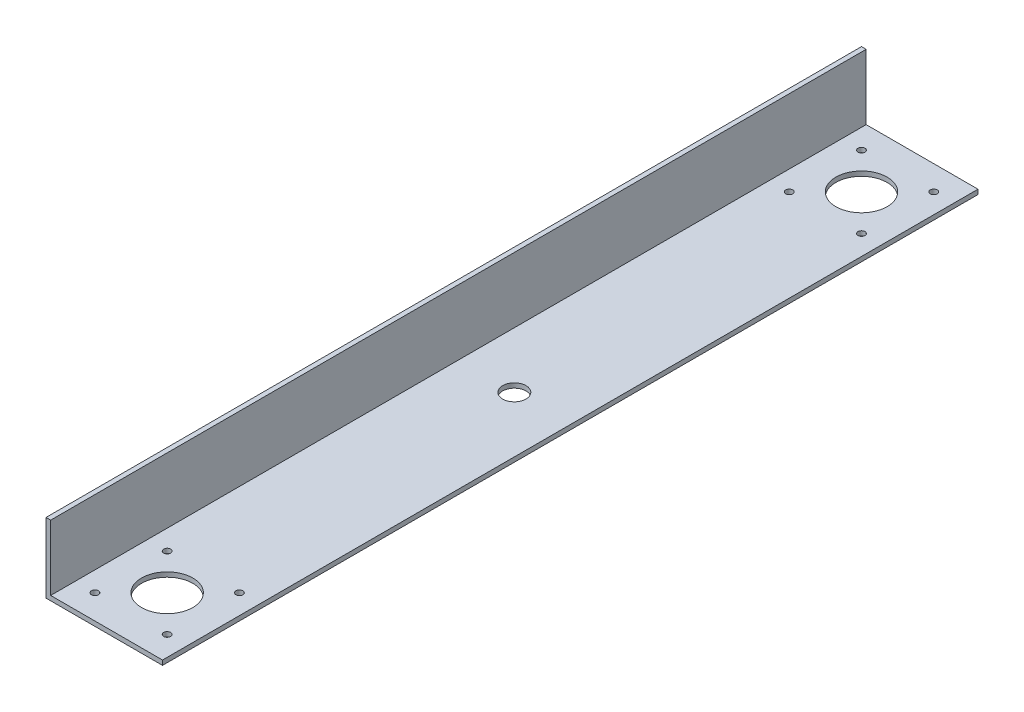
ISO-10303-21;
HEADER;
FILE_DESCRIPTION(('STEP AP214'),'2;1');
FILE_NAME('part.step','',(''),(''),'','','');
FILE_SCHEMA(('AUTOMOTIVE_DESIGN { 1 0 10303 214 1 1 1 1 }'));
ENDSEC;
DATA;
#1=APPLICATION_CONTEXT('core data for automotive mechanical design processes');
#2=APPLICATION_PROTOCOL_DEFINITION('international standard','automotive_design',2000,#1);
#3=PRODUCT_CONTEXT('',#1,'mechanical');
#4=PRODUCT('Part','Part','',(#3));
#5=PRODUCT_RELATED_PRODUCT_CATEGORY('part','',(#4));
#6=PRODUCT_DEFINITION_FORMATION('','',#4);
#7=PRODUCT_DEFINITION_CONTEXT('part definition',#1,'design');
#8=PRODUCT_DEFINITION('design','',#6,#7);
#9=PRODUCT_DEFINITION_SHAPE('','',#8);
#10=(LENGTH_UNIT() NAMED_UNIT(*) SI_UNIT(.MILLI.,.METRE.));
#11=(NAMED_UNIT(*) PLANE_ANGLE_UNIT() SI_UNIT($,.RADIAN.));
#12=(NAMED_UNIT(*) SI_UNIT($,.STERADIAN.) SOLID_ANGLE_UNIT());
#13=UNCERTAINTY_MEASURE_WITH_UNIT(LENGTH_MEASURE(1.E-05),#10,'distance_accuracy_value','');
#14=(GEOMETRIC_REPRESENTATION_CONTEXT(3) GLOBAL_UNCERTAINTY_ASSIGNED_CONTEXT((#13)) GLOBAL_UNIT_ASSIGNED_CONTEXT((#10,
#11,#12)) REPRESENTATION_CONTEXT('',''));
#15=CARTESIAN_POINT('',(0.,0.,0.));
#16=DIRECTION('',(0.,0.,1.));
#17=DIRECTION('',(1.,0.,0.));
#18=AXIS2_PLACEMENT_3D('',#15,#16,#17);
#19=CARTESIAN_POINT('',(50.,0.,350.));
#20=DIRECTION('',(0.,1.,0.));
#21=DIRECTION('',(-1.,0.,0.));
#22=AXIS2_PLACEMENT_3D('',#19,#20,#21);
#23=PLANE('',#22);
#24=CARTESIAN_POINT('',(26.0000005719738,0.,175.));
#25=DIRECTION('',(0.,-1.,0.));
#26=DIRECTION('',(1.,0.,0.));
#27=AXIS2_PLACEMENT_3D('',#24,#25,#26);
#28=CIRCLE('',#27,5.);
#29=CARTESIAN_POINT('',(31.0000005719738,0.,175.));
#30=VERTEX_POINT('',#29);
#31=EDGE_CURVE('E226',#30,#30,#28,.T.);
#32=ORIENTED_EDGE('',*,*,#31,.F.);
#33=EDGE_LOOP('',(#32));
#34=FACE_BOUND('',#33,.T.);
#35=CARTESIAN_POINT('',(10.5,0.,41.5));
#36=DIRECTION('',(0.,-1.,0.));
#37=DIRECTION('',(1.,0.,0.));
#38=AXIS2_PLACEMENT_3D('',#35,#36,#37);
#39=CIRCLE('',#38,1.5);
#40=CARTESIAN_POINT('',(12.,0.,41.5));
#41=VERTEX_POINT('',#40);
#42=EDGE_CURVE('E153',#41,#41,#39,.T.);
#43=ORIENTED_EDGE('',*,*,#42,.F.);
#44=EDGE_LOOP('',(#43));
#45=FACE_BOUND('',#44,.T.);
#46=CARTESIAN_POINT('',(10.5,0.,10.5));
#47=DIRECTION('',(0.,-1.,0.));
#48=DIRECTION('',(1.,0.,0.));
#49=AXIS2_PLACEMENT_3D('',#46,#47,#48);
#50=CIRCLE('',#49,1.49999999999999);
#51=CARTESIAN_POINT('',(12.,0.,10.5));
#52=VERTEX_POINT('',#51);
#53=EDGE_CURVE('E233',#52,#52,#50,.T.);
#54=ORIENTED_EDGE('',*,*,#53,.F.);
#55=EDGE_LOOP('',(#54));
#56=FACE_BOUND('',#55,.T.);
#57=CARTESIAN_POINT('',(41.5,0.,10.5));
#58=DIRECTION('',(0.,-1.,0.));
#59=DIRECTION('',(1.,0.,0.));
#60=AXIS2_PLACEMENT_3D('',#57,#58,#59);
#61=CIRCLE('',#60,1.5);
#62=CARTESIAN_POINT('',(43.,0.,10.5));
#63=VERTEX_POINT('',#62);
#64=EDGE_CURVE('E165',#63,#63,#61,.T.);
#65=ORIENTED_EDGE('',*,*,#64,.F.);
#66=EDGE_LOOP('',(#65));
#67=FACE_BOUND('',#66,.T.);
#68=CARTESIAN_POINT('',(41.5,0.,41.5));
#69=DIRECTION('',(0.,-1.,0.));
#70=DIRECTION('',(1.,0.,0.));
#71=AXIS2_PLACEMENT_3D('',#68,#69,#70);
#72=CIRCLE('',#71,1.49999999999999);
#73=CARTESIAN_POINT('',(43.,0.,41.5));
#74=VERTEX_POINT('',#73);
#75=EDGE_CURVE('E148',#74,#74,#72,.T.);
#76=ORIENTED_EDGE('',*,*,#75,.F.);
#77=EDGE_LOOP('',(#76));
#78=FACE_BOUND('',#77,.T.);
#79=CARTESIAN_POINT('',(26.0000000000068,0.,25.9999999999994));
#80=DIRECTION('',(0.,-1.,0.));
#81=DIRECTION('',(1.,0.,0.));
#82=AXIS2_PLACEMENT_3D('',#79,#80,#81);
#83=CIRCLE('',#82,11.0000000000067);
#84=CARTESIAN_POINT('',(37.0000000000136,0.,25.9999999999994));
#85=VERTEX_POINT('',#84);
#86=EDGE_CURVE('E144',#85,#85,#83,.T.);
#87=ORIENTED_EDGE('',*,*,#86,.F.);
#88=EDGE_LOOP('',(#87));
#89=FACE_BOUND('',#88,.T.);
#90=CARTESIAN_POINT('',(26.0000000000122,0.,323.999999999999));
#91=DIRECTION('',(0.,1.,0.));
#92=DIRECTION('',(0.,0.,1.));
#93=AXIS2_PLACEMENT_3D('',#90,#91,#92);
#94=CIRCLE('',#93,11.0000000000065);
#95=CARTESIAN_POINT('',(26.0000000000122,0.,335.000000000006));
#96=VERTEX_POINT('',#95);
#97=EDGE_CURVE('E169',#96,#96,#94,.T.);
#98=ORIENTED_EDGE('',*,*,#97,.T.);
#99=EDGE_LOOP('',(#98));
#100=FACE_BOUND('',#99,.T.);
#101=CARTESIAN_POINT('',(41.5,0.,308.5));
#102=DIRECTION('',(0.,1.,0.));
#103=DIRECTION('',(0.,0.,1.));
#104=AXIS2_PLACEMENT_3D('',#101,#102,#103);
#105=CIRCLE('',#104,1.49999999999999);
#106=CARTESIAN_POINT('',(41.5,0.,310.));
#107=VERTEX_POINT('',#106);
#108=EDGE_CURVE('E182',#107,#107,#105,.T.);
#109=ORIENTED_EDGE('',*,*,#108,.T.);
#110=EDGE_LOOP('',(#109));
#111=FACE_BOUND('',#110,.T.);
#112=CARTESIAN_POINT('',(10.5,0.,339.5));
#113=DIRECTION('',(0.,1.,0.));
#114=DIRECTION('',(0.,0.,1.));
#115=AXIS2_PLACEMENT_3D('',#112,#113,#114);
#116=CIRCLE('',#115,1.5);
#117=CARTESIAN_POINT('',(10.5,0.,341.));
#118=VERTEX_POINT('',#117);
#119=EDGE_CURVE('E175',#118,#118,#116,.T.);
#120=ORIENTED_EDGE('',*,*,#119,.T.);
#121=EDGE_LOOP('',(#120));
#122=FACE_BOUND('',#121,.T.);
#123=CARTESIAN_POINT('',(10.5,0.,308.5));
#124=DIRECTION('',(0.,1.,0.));
#125=DIRECTION('',(0.,0.,1.));
#126=AXIS2_PLACEMENT_3D('',#123,#124,#125);
#127=CIRCLE('',#126,1.5);
#128=CARTESIAN_POINT('',(10.5,0.,310.));
#129=VERTEX_POINT('',#128);
#130=EDGE_CURVE('E187',#129,#129,#127,.T.);
#131=ORIENTED_EDGE('',*,*,#130,.T.);
#132=EDGE_LOOP('',(#131));
#133=FACE_BOUND('',#132,.T.);
#134=CARTESIAN_POINT('',(41.5,0.,339.5));
#135=DIRECTION('',(0.,1.,0.));
#136=DIRECTION('',(0.,0.,1.));
#137=AXIS2_PLACEMENT_3D('',#134,#135,#136);
#138=CIRCLE('',#137,1.50000000000002);
#139=CARTESIAN_POINT('',(41.5,0.,341.));
#140=VERTEX_POINT('',#139);
#141=EDGE_CURVE('E127',#140,#140,#138,.T.);
#142=ORIENTED_EDGE('',*,*,#141,.T.);
#143=EDGE_LOOP('',(#142));
#144=FACE_BOUND('',#143,.T.);
#145=DIRECTION('',(1.,0.,0.));
#146=VECTOR('',#145,1.);
#147=CARTESIAN_POINT('',(50.,0.,0.));
#148=LINE('',#147,#146);
#149=CARTESIAN_POINT('',(0.,0.,0.));
#150=VERTEX_POINT('',#149);
#151=CARTESIAN_POINT('',(50.,0.,0.));
#152=VERTEX_POINT('',#151);
#153=EDGE_CURVE('E123',#150,#152,#148,.T.);
#154=ORIENTED_EDGE('',*,*,#153,.T.);
#155=DIRECTION('',(0.,0.,-1.));
#156=VECTOR('',#155,1.);
#157=CARTESIAN_POINT('',(50.,0.,350.));
#158=LINE('',#157,#156);
#159=CARTESIAN_POINT('',(50.,0.,350.));
#160=VERTEX_POINT('',#159);
#161=EDGE_CURVE('E11',#160,#152,#158,.T.);
#162=ORIENTED_EDGE('',*,*,#161,.F.);
#163=DIRECTION('',(1.,0.,0.));
#164=VECTOR('',#163,1.);
#165=CARTESIAN_POINT('',(50.,0.,350.));
#166=LINE('',#165,#164);
#167=CARTESIAN_POINT('',(0.,0.,350.));
#168=VERTEX_POINT('',#167);
#169=EDGE_CURVE('E134',#168,#160,#166,.T.);
#170=ORIENTED_EDGE('',*,*,#169,.F.);
#171=DIRECTION('',(0.,0.,-1.));
#172=VECTOR('',#171,1.);
#173=CARTESIAN_POINT('',(0.,0.,350.));
#174=LINE('',#173,#172);
#175=EDGE_CURVE('E119',#168,#150,#174,.T.);
#176=ORIENTED_EDGE('',*,*,#175,.T.);
#177=EDGE_LOOP('',(#154,#162,#170,#176));
#178=FACE_BOUND('',#177,.T.);
#179=ADVANCED_FACE('F37',(#34,#45,#56,#67,#78,#89,#100,#111,#122,#133,#144,#178),#23,.F.);
#180=CARTESIAN_POINT('',(50.,2.,350.));
#181=DIRECTION('',(-1.,0.,0.));
#182=DIRECTION('',(0.,0.,1.));
#183=AXIS2_PLACEMENT_3D('',#180,#181,#182);
#184=PLANE('',#183);
#185=DIRECTION('',(0.,1.,0.));
#186=VECTOR('',#185,1.);
#187=CARTESIAN_POINT('',(50.,2.,0.));
#188=LINE('',#187,#186);
#189=CARTESIAN_POINT('',(50.,2.,0.));
#190=VERTEX_POINT('',#189);
#191=EDGE_CURVE('E126',#152,#190,#188,.T.);
#192=ORIENTED_EDGE('',*,*,#191,.T.);
#193=DIRECTION('',(0.,0.,-1.));
#194=VECTOR('',#193,1.);
#195=CARTESIAN_POINT('',(50.,2.,350.));
#196=LINE('',#195,#194);
#197=CARTESIAN_POINT('',(50.,2.,350.));
#198=VERTEX_POINT('',#197);
#199=EDGE_CURVE('E46',#198,#190,#196,.T.);
#200=ORIENTED_EDGE('',*,*,#199,.F.);
#201=DIRECTION('',(0.,1.,0.));
#202=VECTOR('',#201,1.);
#203=CARTESIAN_POINT('',(50.,2.,350.));
#204=LINE('',#203,#202);
#205=EDGE_CURVE('E92',#160,#198,#204,.T.);
#206=ORIENTED_EDGE('',*,*,#205,.F.);
#207=ORIENTED_EDGE('',*,*,#161,.T.);
#208=EDGE_LOOP('',(#192,#200,#206,#207));
#209=FACE_BOUND('',#208,.T.);
#210=ADVANCED_FACE('F200',(#209),#184,.F.);
#211=CARTESIAN_POINT('',(2.,2.,350.));
#212=DIRECTION('',(0.,-1.,0.));
#213=DIRECTION('',(0.,0.,-1.));
#214=AXIS2_PLACEMENT_3D('',#211,#212,#213);
#215=PLANE('',#214);
#216=CARTESIAN_POINT('',(26.0000005719738,2.,175.));
#217=DIRECTION('',(0.,-1.,0.));
#218=DIRECTION('',(0.,0.,-1.));
#219=AXIS2_PLACEMENT_3D('',#216,#217,#218);
#220=CIRCLE('',#219,5.);
#221=CARTESIAN_POINT('',(26.0000005719738,2.,170.));
#222=VERTEX_POINT('',#221);
#223=EDGE_CURVE('E40',#222,#222,#220,.T.);
#224=ORIENTED_EDGE('',*,*,#223,.T.);
#225=EDGE_LOOP('',(#224));
#226=FACE_BOUND('',#225,.T.);
#227=CARTESIAN_POINT('',(10.5,2.,41.5));
#228=DIRECTION('',(0.,-1.,0.));
#229=DIRECTION('',(0.,0.,-1.));
#230=AXIS2_PLACEMENT_3D('',#227,#228,#229);
#231=CIRCLE('',#230,1.5);
#232=CARTESIAN_POINT('',(10.5,2.,40.));
#233=VERTEX_POINT('',#232);
#234=EDGE_CURVE('E155',#233,#233,#231,.T.);
#235=ORIENTED_EDGE('',*,*,#234,.T.);
#236=EDGE_LOOP('',(#235));
#237=FACE_BOUND('',#236,.T.);
#238=CARTESIAN_POINT('',(10.5,2.,10.5));
#239=DIRECTION('',(0.,-1.,0.));
#240=DIRECTION('',(0.,0.,-1.));
#241=AXIS2_PLACEMENT_3D('',#238,#239,#240);
#242=CIRCLE('',#241,1.49999999999999);
#243=CARTESIAN_POINT('',(10.5,2.,9.00000000000001));
#244=VERTEX_POINT('',#243);
#245=EDGE_CURVE('E152',#244,#244,#242,.T.);
#246=ORIENTED_EDGE('',*,*,#245,.T.);
#247=EDGE_LOOP('',(#246));
#248=FACE_BOUND('',#247,.T.);
#249=CARTESIAN_POINT('',(41.5,2.,10.5));
#250=DIRECTION('',(0.,-1.,0.));
#251=DIRECTION('',(0.,0.,-1.));
#252=AXIS2_PLACEMENT_3D('',#249,#250,#251);
#253=CIRCLE('',#252,1.5);
#254=CARTESIAN_POINT('',(41.5,2.,9.00000000000002));
#255=VERTEX_POINT('',#254);
#256=EDGE_CURVE('E149',#255,#255,#253,.T.);
#257=ORIENTED_EDGE('',*,*,#256,.T.);
#258=EDGE_LOOP('',(#257));
#259=FACE_BOUND('',#258,.T.);
#260=CARTESIAN_POINT('',(41.5,2.,41.5));
#261=DIRECTION('',(0.,-1.,0.));
#262=DIRECTION('',(0.,0.,-1.));
#263=AXIS2_PLACEMENT_3D('',#260,#261,#262);
#264=CIRCLE('',#263,1.49999999999999);
#265=CARTESIAN_POINT('',(41.5,2.,40.));
#266=VERTEX_POINT('',#265);
#267=EDGE_CURVE('E145',#266,#266,#264,.T.);
#268=ORIENTED_EDGE('',*,*,#267,.T.);
#269=EDGE_LOOP('',(#268));
#270=FACE_BOUND('',#269,.T.);
#271=CARTESIAN_POINT('',(26.0000000000068,2.,25.9999999999994));
#272=DIRECTION('',(0.,-1.,0.));
#273=DIRECTION('',(0.,0.,-1.));
#274=AXIS2_PLACEMENT_3D('',#271,#272,#273);
#275=CIRCLE('',#274,11.0000000000067);
#276=CARTESIAN_POINT('',(26.0000000000068,2.,14.9999999999926));
#277=VERTEX_POINT('',#276);
#278=EDGE_CURVE('E140',#277,#277,#275,.T.);
#279=ORIENTED_EDGE('',*,*,#278,.T.);
#280=EDGE_LOOP('',(#279));
#281=FACE_BOUND('',#280,.T.);
#282=CARTESIAN_POINT('',(26.0000000000122,2.,323.999999999999));
#283=DIRECTION('',(0.,1.,0.));
#284=DIRECTION('',(0.,0.,1.));
#285=AXIS2_PLACEMENT_3D('',#282,#283,#284);
#286=CIRCLE('',#285,11.0000000000065);
#287=CARTESIAN_POINT('',(26.0000000000122,2.,335.000000000006));
#288=VERTEX_POINT('',#287);
#289=EDGE_CURVE('E143',#288,#288,#286,.T.);
#290=ORIENTED_EDGE('',*,*,#289,.F.);
#291=EDGE_LOOP('',(#290));
#292=FACE_BOUND('',#291,.T.);
#293=CARTESIAN_POINT('',(41.5,2.,308.5));
#294=DIRECTION('',(0.,1.,0.));
#295=DIRECTION('',(0.,0.,1.));
#296=AXIS2_PLACEMENT_3D('',#293,#294,#295);
#297=CIRCLE('',#296,1.49999999999999);
#298=CARTESIAN_POINT('',(41.5,2.,310.));
#299=VERTEX_POINT('',#298);
#300=EDGE_CURVE('E172',#299,#299,#297,.T.);
#301=ORIENTED_EDGE('',*,*,#300,.F.);
#302=EDGE_LOOP('',(#301));
#303=FACE_BOUND('',#302,.T.);
#304=CARTESIAN_POINT('',(10.5,2.,339.5));
#305=DIRECTION('',(0.,1.,0.));
#306=DIRECTION('',(0.,0.,1.));
#307=AXIS2_PLACEMENT_3D('',#304,#305,#306);
#308=CIRCLE('',#307,1.5);
#309=CARTESIAN_POINT('',(10.5,2.,341.));
#310=VERTEX_POINT('',#309);
#311=EDGE_CURVE('E179',#310,#310,#308,.T.);
#312=ORIENTED_EDGE('',*,*,#311,.F.);
#313=EDGE_LOOP('',(#312));
#314=FACE_BOUND('',#313,.T.);
#315=CARTESIAN_POINT('',(10.5,2.,308.5));
#316=DIRECTION('',(0.,1.,0.));
#317=DIRECTION('',(0.,0.,1.));
#318=AXIS2_PLACEMENT_3D('',#315,#316,#317);
#319=CIRCLE('',#318,1.5);
#320=CARTESIAN_POINT('',(10.5,2.,310.));
#321=VERTEX_POINT('',#320);
#322=EDGE_CURVE('E178',#321,#321,#319,.T.);
#323=ORIENTED_EDGE('',*,*,#322,.F.);
#324=EDGE_LOOP('',(#323));
#325=FACE_BOUND('',#324,.T.);
#326=CARTESIAN_POINT('',(41.5,2.,339.5));
#327=DIRECTION('',(0.,1.,0.));
#328=DIRECTION('',(0.,0.,1.));
#329=AXIS2_PLACEMENT_3D('',#326,#327,#328);
#330=CIRCLE('',#329,1.50000000000002);
#331=CARTESIAN_POINT('',(41.5,2.,341.));
#332=VERTEX_POINT('',#331);
#333=EDGE_CURVE('E190',#332,#332,#330,.T.);
#334=ORIENTED_EDGE('',*,*,#333,.F.);
#335=EDGE_LOOP('',(#334));
#336=FACE_BOUND('',#335,.T.);
#337=DIRECTION('',(-1.,0.,0.));
#338=VECTOR('',#337,1.);
#339=CARTESIAN_POINT('',(2.,2.,0.));
#340=LINE('',#339,#338);
#341=CARTESIAN_POINT('',(2.,2.,0.));
#342=VERTEX_POINT('',#341);
#343=EDGE_CURVE('E129',#190,#342,#340,.T.);
#344=ORIENTED_EDGE('',*,*,#343,.T.);
#345=DIRECTION('',(0.,0.,-1.));
#346=VECTOR('',#345,1.);
#347=CARTESIAN_POINT('',(2.,2.,350.));
#348=LINE('',#347,#346);
#349=CARTESIAN_POINT('',(2.,2.,350.));
#350=VERTEX_POINT('',#349);
#351=EDGE_CURVE('E114',#350,#342,#348,.T.);
#352=ORIENTED_EDGE('',*,*,#351,.F.);
#353=DIRECTION('',(-1.,0.,0.));
#354=VECTOR('',#353,1.);
#355=CARTESIAN_POINT('',(2.,2.,350.));
#356=LINE('',#355,#354);
#357=EDGE_CURVE('E105',#198,#350,#356,.T.);
#358=ORIENTED_EDGE('',*,*,#357,.F.);
#359=ORIENTED_EDGE('',*,*,#199,.T.);
#360=EDGE_LOOP('',(#344,#352,#358,#359));
#361=FACE_BOUND('',#360,.T.);
#362=ADVANCED_FACE('F203',(#226,#237,#248,#259,#270,#281,#292,#303,#314,#325,#336,#361),#215,.F.);
#363=CARTESIAN_POINT('',(2.,30.,350.));
#364=DIRECTION('',(-1.,0.,0.));
#365=DIRECTION('',(0.,0.,1.));
#366=AXIS2_PLACEMENT_3D('',#363,#364,#365);
#367=PLANE('',#366);
#368=DIRECTION('',(0.,1.,0.));
#369=VECTOR('',#368,1.);
#370=CARTESIAN_POINT('',(2.,30.,0.));
#371=LINE('',#370,#369);
#372=CARTESIAN_POINT('',(2.,30.,0.));
#373=VERTEX_POINT('',#372);
#374=EDGE_CURVE('E113',#342,#373,#371,.T.);
#375=ORIENTED_EDGE('',*,*,#374,.T.);
#376=DIRECTION('',(0.,0.,-1.));
#377=VECTOR('',#376,1.);
#378=CARTESIAN_POINT('',(2.,30.,350.));
#379=LINE('',#378,#377);
#380=CARTESIAN_POINT('',(2.,30.,350.));
#381=VERTEX_POINT('',#380);
#382=EDGE_CURVE('E110',#381,#373,#379,.T.);
#383=ORIENTED_EDGE('',*,*,#382,.F.);
#384=DIRECTION('',(0.,1.,0.));
#385=VECTOR('',#384,1.);
#386=CARTESIAN_POINT('',(2.,30.,350.));
#387=LINE('',#386,#385);
#388=EDGE_CURVE('E99',#350,#381,#387,.T.);
#389=ORIENTED_EDGE('',*,*,#388,.F.);
#390=ORIENTED_EDGE('',*,*,#351,.T.);
#391=EDGE_LOOP('',(#375,#383,#389,#390));
#392=FACE_BOUND('',#391,.T.);
#393=ADVANCED_FACE('F111',(#392),#367,.F.);
#394=CARTESIAN_POINT('',(0.,30.,350.));
#395=DIRECTION('',(0.,-1.,0.));
#396=DIRECTION('',(0.,0.,-1.));
#397=AXIS2_PLACEMENT_3D('',#394,#395,#396);
#398=PLANE('',#397);
#399=DIRECTION('',(-1.,0.,0.));
#400=VECTOR('',#399,1.);
#401=CARTESIAN_POINT('',(0.,30.,0.));
#402=LINE('',#401,#400);
#403=CARTESIAN_POINT('',(0.,30.,0.));
#404=VERTEX_POINT('',#403);
#405=EDGE_CURVE('E78',#373,#404,#402,.T.);
#406=ORIENTED_EDGE('',*,*,#405,.T.);
#407=DIRECTION('',(0.,0.,-1.));
#408=VECTOR('',#407,1.);
#409=CARTESIAN_POINT('',(0.,30.,350.));
#410=LINE('',#409,#408);
#411=CARTESIAN_POINT('',(0.,30.,350.));
#412=VERTEX_POINT('',#411);
#413=EDGE_CURVE('E115',#412,#404,#410,.T.);
#414=ORIENTED_EDGE('',*,*,#413,.F.);
#415=DIRECTION('',(-1.,0.,0.));
#416=VECTOR('',#415,1.);
#417=CARTESIAN_POINT('',(0.,30.,350.));
#418=LINE('',#417,#416);
#419=EDGE_CURVE('E103',#381,#412,#418,.T.);
#420=ORIENTED_EDGE('',*,*,#419,.F.);
#421=ORIENTED_EDGE('',*,*,#382,.T.);
#422=EDGE_LOOP('',(#406,#414,#420,#421));
#423=FACE_BOUND('',#422,.T.);
#424=ADVANCED_FACE('F117',(#423),#398,.F.);
#425=CARTESIAN_POINT('',(0.,0.,350.));
#426=DIRECTION('',(1.,0.,0.));
#427=DIRECTION('',(0.,0.,-1.));
#428=AXIS2_PLACEMENT_3D('',#425,#426,#427);
#429=PLANE('',#428);
#430=DIRECTION('',(0.,-1.,0.));
#431=VECTOR('',#430,1.);
#432=CARTESIAN_POINT('',(0.,0.,0.));
#433=LINE('',#432,#431);
#434=EDGE_CURVE('E84',#404,#150,#433,.T.);
#435=ORIENTED_EDGE('',*,*,#434,.T.);
#436=ORIENTED_EDGE('',*,*,#175,.F.);
#437=DIRECTION('',(0.,-1.,0.));
#438=VECTOR('',#437,1.);
#439=CARTESIAN_POINT('',(0.,0.,350.));
#440=LINE('',#439,#438);
#441=EDGE_CURVE('E55',#412,#168,#440,.T.);
#442=ORIENTED_EDGE('',*,*,#441,.F.);
#443=ORIENTED_EDGE('',*,*,#413,.T.);
#444=EDGE_LOOP('',(#435,#436,#442,#443));
#445=FACE_BOUND('',#444,.T.);
#446=ADVANCED_FACE('F208',(#445),#429,.F.);
#447=CARTESIAN_POINT('',(0.,0.,350.));
#448=DIRECTION('',(0.,0.,-1.));
#449=DIRECTION('',(-1.,0.,0.));
#450=AXIS2_PLACEMENT_3D('',#447,#448,#449);
#451=PLANE('',#450);
#452=ORIENTED_EDGE('',*,*,#169,.T.);
#453=ORIENTED_EDGE('',*,*,#205,.T.);
#454=ORIENTED_EDGE('',*,*,#357,.T.);
#455=ORIENTED_EDGE('',*,*,#388,.T.);
#456=ORIENTED_EDGE('',*,*,#419,.T.);
#457=ORIENTED_EDGE('',*,*,#441,.T.);
#458=EDGE_LOOP('',(#452,#453,#454,#455,#456,#457));
#459=FACE_BOUND('',#458,.T.);
#460=ADVANCED_FACE('F101',(#459),#451,.F.);
#461=CARTESIAN_POINT('',(0.,0.,0.));
#462=DIRECTION('',(0.,0.,-1.));
#463=DIRECTION('',(-1.,0.,0.));
#464=AXIS2_PLACEMENT_3D('',#461,#462,#463);
#465=PLANE('',#464);
#466=ORIENTED_EDGE('',*,*,#153,.F.);
#467=ORIENTED_EDGE('',*,*,#434,.F.);
#468=ORIENTED_EDGE('',*,*,#405,.F.);
#469=ORIENTED_EDGE('',*,*,#374,.F.);
#470=ORIENTED_EDGE('',*,*,#343,.F.);
#471=ORIENTED_EDGE('',*,*,#191,.F.);
#472=EDGE_LOOP('',(#466,#467,#468,#469,#470,#471));
#473=FACE_BOUND('',#472,.T.);
#474=ADVANCED_FACE('F206',(#473),#465,.T.);
#475=CARTESIAN_POINT('',(41.5,0.,339.5));
#476=DIRECTION('',(0.,1.,0.));
#477=DIRECTION('',(0.,0.,1.));
#478=AXIS2_PLACEMENT_3D('',#475,#476,#477);
#479=CYLINDRICAL_SURFACE('',#478,1.50000000000002);
#480=ORIENTED_EDGE('',*,*,#141,.F.);
#481=EDGE_LOOP('',(#480));
#482=FACE_BOUND('',#481,.T.);
#483=ORIENTED_EDGE('',*,*,#333,.T.);
#484=EDGE_LOOP('',(#483));
#485=FACE_BOUND('',#484,.T.);
#486=ADVANCED_FACE('F250',(#482,#485),#479,.F.);
#487=CARTESIAN_POINT('',(10.5,0.,308.5));
#488=DIRECTION('',(0.,1.,0.));
#489=DIRECTION('',(0.,0.,1.));
#490=AXIS2_PLACEMENT_3D('',#487,#488,#489);
#491=CYLINDRICAL_SURFACE('',#490,1.5);
#492=ORIENTED_EDGE('',*,*,#130,.F.);
#493=EDGE_LOOP('',(#492));
#494=FACE_BOUND('',#493,.T.);
#495=ORIENTED_EDGE('',*,*,#322,.T.);
#496=EDGE_LOOP('',(#495));
#497=FACE_BOUND('',#496,.T.);
#498=ADVANCED_FACE('F253',(#494,#497),#491,.F.);
#499=CARTESIAN_POINT('',(10.5,0.,339.5));
#500=DIRECTION('',(0.,1.,0.));
#501=DIRECTION('',(0.,0.,1.));
#502=AXIS2_PLACEMENT_3D('',#499,#500,#501);
#503=CYLINDRICAL_SURFACE('',#502,1.5);
#504=ORIENTED_EDGE('',*,*,#119,.F.);
#505=EDGE_LOOP('',(#504));
#506=FACE_BOUND('',#505,.T.);
#507=ORIENTED_EDGE('',*,*,#311,.T.);
#508=EDGE_LOOP('',(#507));
#509=FACE_BOUND('',#508,.T.);
#510=ADVANCED_FACE('F284',(#506,#509),#503,.F.);
#511=CARTESIAN_POINT('',(41.5,0.,308.5));
#512=DIRECTION('',(0.,1.,0.));
#513=DIRECTION('',(0.,0.,1.));
#514=AXIS2_PLACEMENT_3D('',#511,#512,#513);
#515=CYLINDRICAL_SURFACE('',#514,1.49999999999999);
#516=ORIENTED_EDGE('',*,*,#108,.F.);
#517=EDGE_LOOP('',(#516));
#518=FACE_BOUND('',#517,.T.);
#519=ORIENTED_EDGE('',*,*,#300,.T.);
#520=EDGE_LOOP('',(#519));
#521=FACE_BOUND('',#520,.T.);
#522=ADVANCED_FACE('F290',(#518,#521),#515,.F.);
#523=CARTESIAN_POINT('',(26.0000000000122,0.,323.999999999999));
#524=DIRECTION('',(0.,1.,0.));
#525=DIRECTION('',(0.,0.,1.));
#526=AXIS2_PLACEMENT_3D('',#523,#524,#525);
#527=CYLINDRICAL_SURFACE('',#526,11.0000000000065);
#528=ORIENTED_EDGE('',*,*,#97,.F.);
#529=EDGE_LOOP('',(#528));
#530=FACE_BOUND('',#529,.T.);
#531=ORIENTED_EDGE('',*,*,#289,.T.);
#532=EDGE_LOOP('',(#531));
#533=FACE_BOUND('',#532,.T.);
#534=ADVANCED_FACE('F322',(#530,#533),#527,.F.);
#535=CARTESIAN_POINT('',(26.0000000000068,30.,25.9999999999994));
#536=DIRECTION('',(0.,-1.,0.));
#537=DIRECTION('',(1.,0.,0.));
#538=AXIS2_PLACEMENT_3D('',#535,#536,#537);
#539=CYLINDRICAL_SURFACE('',#538,11.0000000000067);
#540=ORIENTED_EDGE('',*,*,#86,.T.);
#541=EDGE_LOOP('',(#540));
#542=FACE_BOUND('',#541,.T.);
#543=ORIENTED_EDGE('',*,*,#278,.F.);
#544=EDGE_LOOP('',(#543));
#545=FACE_BOUND('',#544,.T.);
#546=ADVANCED_FACE('F331',(#542,#545),#539,.F.);
#547=CARTESIAN_POINT('',(41.5,30.,41.5));
#548=DIRECTION('',(0.,-1.,0.));
#549=DIRECTION('',(1.,0.,0.));
#550=AXIS2_PLACEMENT_3D('',#547,#548,#549);
#551=CYLINDRICAL_SURFACE('',#550,1.49999999999999);
#552=ORIENTED_EDGE('',*,*,#75,.T.);
#553=EDGE_LOOP('',(#552));
#554=FACE_BOUND('',#553,.T.);
#555=ORIENTED_EDGE('',*,*,#267,.F.);
#556=EDGE_LOOP('',(#555));
#557=FACE_BOUND('',#556,.T.);
#558=ADVANCED_FACE('F341',(#554,#557),#551,.F.);
#559=CARTESIAN_POINT('',(41.5,30.,10.5));
#560=DIRECTION('',(0.,-1.,0.));
#561=DIRECTION('',(1.,0.,0.));
#562=AXIS2_PLACEMENT_3D('',#559,#560,#561);
#563=CYLINDRICAL_SURFACE('',#562,1.5);
#564=ORIENTED_EDGE('',*,*,#64,.T.);
#565=EDGE_LOOP('',(#564));
#566=FACE_BOUND('',#565,.T.);
#567=ORIENTED_EDGE('',*,*,#256,.F.);
#568=EDGE_LOOP('',(#567));
#569=FACE_BOUND('',#568,.T.);
#570=ADVANCED_FACE('F351',(#566,#569),#563,.F.);
#571=CARTESIAN_POINT('',(10.5,30.,10.5));
#572=DIRECTION('',(0.,-1.,0.));
#573=DIRECTION('',(1.,0.,0.));
#574=AXIS2_PLACEMENT_3D('',#571,#572,#573);
#575=CYLINDRICAL_SURFACE('',#574,1.49999999999999);
#576=ORIENTED_EDGE('',*,*,#53,.T.);
#577=EDGE_LOOP('',(#576));
#578=FACE_BOUND('',#577,.T.);
#579=ORIENTED_EDGE('',*,*,#245,.F.);
#580=EDGE_LOOP('',(#579));
#581=FACE_BOUND('',#580,.T.);
#582=ADVANCED_FACE('F360',(#578,#581),#575,.F.);
#583=CARTESIAN_POINT('',(10.5,30.,41.5));
#584=DIRECTION('',(0.,-1.,0.));
#585=DIRECTION('',(1.,0.,0.));
#586=AXIS2_PLACEMENT_3D('',#583,#584,#585);
#587=CYLINDRICAL_SURFACE('',#586,1.5);
#588=ORIENTED_EDGE('',*,*,#42,.T.);
#589=EDGE_LOOP('',(#588));
#590=FACE_BOUND('',#589,.T.);
#591=ORIENTED_EDGE('',*,*,#234,.F.);
#592=EDGE_LOOP('',(#591));
#593=FACE_BOUND('',#592,.T.);
#594=ADVANCED_FACE('F370',(#590,#593),#587,.F.);
#595=CARTESIAN_POINT('',(26.0000005719738,30.,175.));
#596=DIRECTION('',(0.,-1.,0.));
#597=DIRECTION('',(1.,0.,0.));
#598=AXIS2_PLACEMENT_3D('',#595,#596,#597);
#599=CYLINDRICAL_SURFACE('',#598,5.);
#600=ORIENTED_EDGE('',*,*,#31,.T.);
#601=EDGE_LOOP('',(#600));
#602=FACE_BOUND('',#601,.T.);
#603=ORIENTED_EDGE('',*,*,#223,.F.);
#604=EDGE_LOOP('',(#603));
#605=FACE_BOUND('',#604,.T.);
#606=ADVANCED_FACE('F379',(#602,#605),#599,.F.);
#607=CLOSED_SHELL('',(#179,#210,#362,#393,#424,#446,#460,#474,#486,#498,#510,#522,#534,#546,
#558,#570,#582,#594,#606));
#608=MANIFOLD_SOLID_BREP('B2',#607);
#609=ADVANCED_BREP_SHAPE_REPRESENTATION('',(#18,#608),#14);
#610=SHAPE_DEFINITION_REPRESENTATION(#9,#609);
ENDSEC;
END-ISO-10303-21;
